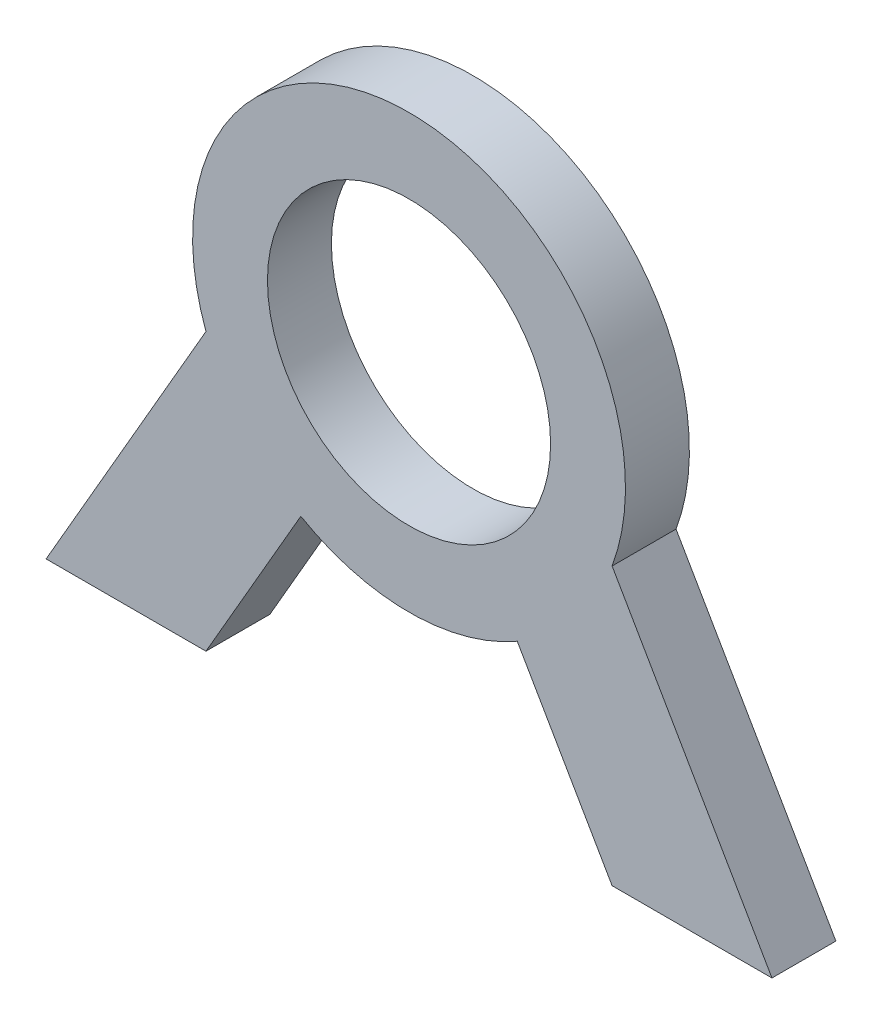
ISO-10303-21;
HEADER;
FILE_DESCRIPTION(('STEP AP214'),'2;1');
FILE_NAME('part.step','',(''),(''),'','','');
FILE_SCHEMA(('AUTOMOTIVE_DESIGN { 1 0 10303 214 1 1 1 1 }'));
ENDSEC;
DATA;
#1=APPLICATION_CONTEXT('core data for automotive mechanical design processes');
#2=APPLICATION_PROTOCOL_DEFINITION('international standard','automotive_design',2000,#1);
#3=PRODUCT_CONTEXT('',#1,'mechanical');
#4=PRODUCT('Part','Part','',(#3));
#5=PRODUCT_RELATED_PRODUCT_CATEGORY('part','',(#4));
#6=PRODUCT_DEFINITION_FORMATION('','',#4);
#7=PRODUCT_DEFINITION_CONTEXT('part definition',#1,'design');
#8=PRODUCT_DEFINITION('design','',#6,#7);
#9=PRODUCT_DEFINITION_SHAPE('','',#8);
#10=(LENGTH_UNIT() NAMED_UNIT(*) SI_UNIT(.MILLI.,.METRE.));
#11=(NAMED_UNIT(*) PLANE_ANGLE_UNIT() SI_UNIT($,.RADIAN.));
#12=(NAMED_UNIT(*) SI_UNIT($,.STERADIAN.) SOLID_ANGLE_UNIT());
#13=UNCERTAINTY_MEASURE_WITH_UNIT(LENGTH_MEASURE(1.E-05),#10,'distance_accuracy_value','');
#14=(GEOMETRIC_REPRESENTATION_CONTEXT(3) GLOBAL_UNCERTAINTY_ASSIGNED_CONTEXT((#13)) GLOBAL_UNIT_ASSIGNED_CONTEXT((#10,
#11,#12)) REPRESENTATION_CONTEXT('',''));
#15=CARTESIAN_POINT('',(0.,0.,0.));
#16=DIRECTION('',(0.,0.,1.));
#17=DIRECTION('',(1.,0.,0.));
#18=AXIS2_PLACEMENT_3D('',#15,#16,#17);
#19=CARTESIAN_POINT('',(0.,27.9451054,5.08));
#20=DIRECTION('',(0.,0.,1.));
#21=DIRECTION('',(1.,0.,0.));
#22=AXIS2_PLACEMENT_3D('',#19,#20,#21);
#23=PLANE('',#22);
#24=DIRECTION('',(1.,0.,0.));
#25=VECTOR('',#24,1.);
#26=CARTESIAN_POINT('',(16.1341141252224,0.,5.08));
#27=LINE('',#26,#25);
#28=CARTESIAN_POINT('',(16.1341141252224,0.,5.08));
#29=VERTEX_POINT('',#28);
#30=CARTESIAN_POINT('',(28.8341141252224,0.,5.08));
#31=VERTEX_POINT('',#30);
#32=EDGE_CURVE('E168',#29,#31,#27,.T.);
#33=ORIENTED_EDGE('',*,*,#32,.T.);
#34=DIRECTION('',(-0.499999999999998,0.86602540378444,0.));
#35=VECTOR('',#34,1.);
#36=CARTESIAN_POINT('',(28.8341141252224,0.,5.08));
#37=LINE('',#36,#35);
#38=CARTESIAN_POINT('',(16.1341141252224,21.9970452561248,5.08));
#39=VERTEX_POINT('',#38);
#40=EDGE_CURVE('E104',#31,#39,#37,.T.);
#41=ORIENTED_EDGE('',*,*,#40,.T.);
#42=CARTESIAN_POINT('',(0.,27.9451054,5.08));
#43=DIRECTION('',(0.,0.,1.));
#44=DIRECTION('',(1.,0.,0.));
#45=AXIS2_PLACEMENT_3D('',#42,#43,#44);
#46=CIRCLE('',#45,17.1956115936845);
#47=CARTESIAN_POINT('',(-16.1341141252225,21.997045256125,5.08));
#48=VERTEX_POINT('',#47);
#49=EDGE_CURVE('E189',#39,#48,#46,.T.);
#50=ORIENTED_EDGE('',*,*,#49,.T.);
#51=DIRECTION('',(-0.5,-0.866025403784438,0.));
#52=VECTOR('',#51,1.);
#53=CARTESIAN_POINT('',(-28.8341141252226,0.,5.08));
#54=LINE('',#53,#52);
#55=CARTESIAN_POINT('',(-28.8341141252226,0.,5.08));
#56=VERTEX_POINT('',#55);
#57=EDGE_CURVE('E203',#48,#56,#54,.T.);
#58=ORIENTED_EDGE('',*,*,#57,.T.);
#59=DIRECTION('',(1.,0.,0.));
#60=VECTOR('',#59,1.);
#61=CARTESIAN_POINT('',(-16.1341141252226,0.,5.08));
#62=LINE('',#61,#60);
#63=CARTESIAN_POINT('',(-16.1341141252226,0.,5.08));
#64=VERTEX_POINT('',#63);
#65=EDGE_CURVE('E123',#56,#64,#62,.T.);
#66=ORIENTED_EDGE('',*,*,#65,.T.);
#67=DIRECTION('',(0.500000000000004,0.866025403784436,0.));
#68=VECTOR('',#67,1.);
#69=CARTESIAN_POINT('',(-16.1341141252226,0.,5.08));
#70=LINE('',#69,#68);
#71=CARTESIAN_POINT('',(-8.59780579684235,13.053268926259,5.08));
#72=VERTEX_POINT('',#71);
#73=EDGE_CURVE('E117',#64,#72,#70,.T.);
#74=ORIENTED_EDGE('',*,*,#73,.T.);
#75=CARTESIAN_POINT('',(0.,27.9451054,5.08));
#76=DIRECTION('',(0.,0.,1.));
#77=DIRECTION('',(1.,0.,0.));
#78=AXIS2_PLACEMENT_3D('',#75,#76,#77);
#79=CIRCLE('',#78,17.1956115936845);
#80=CARTESIAN_POINT('',(8.59780579684223,13.0532689262589,5.08));
#81=VERTEX_POINT('',#80);
#82=EDGE_CURVE('E121',#72,#81,#79,.T.);
#83=ORIENTED_EDGE('',*,*,#82,.T.);
#84=DIRECTION('',(0.499999999999998,-0.86602540378444,0.));
#85=VECTOR('',#84,1.);
#86=CARTESIAN_POINT('',(16.1341141252224,0.,5.08));
#87=LINE('',#86,#85);
#88=EDGE_CURVE('E61',#81,#29,#87,.T.);
#89=ORIENTED_EDGE('',*,*,#88,.T.);
#90=EDGE_LOOP('',(#33,#41,#50,#58,#66,#74,#83,#89));
#91=FACE_BOUND('',#90,.T.);
#92=CARTESIAN_POINT('',(0.,27.9451054,5.08));
#93=DIRECTION('',(0.,0.,1.));
#94=DIRECTION('',(1.,0.,0.));
#95=AXIS2_PLACEMENT_3D('',#92,#93,#94);
#96=CIRCLE('',#95,11.24712);
#97=CARTESIAN_POINT('',(11.24712,27.9451054,5.08));
#98=VERTEX_POINT('',#97);
#99=EDGE_CURVE('E150',#98,#98,#96,.T.);
#100=ORIENTED_EDGE('',*,*,#99,.F.);
#101=EDGE_LOOP('',(#100));
#102=FACE_BOUND('',#101,.T.);
#103=ADVANCED_FACE('F43',(#91,#102),#23,.T.);
#104=CARTESIAN_POINT('',(0.,27.9451054,0.));
#105=DIRECTION('',(0.,0.,1.));
#106=DIRECTION('',(1.,0.,0.));
#107=AXIS2_PLACEMENT_3D('',#104,#105,#106);
#108=PLANE('',#107);
#109=DIRECTION('',(1.,0.,0.));
#110=VECTOR('',#109,1.);
#111=CARTESIAN_POINT('',(16.1341141252224,0.,0.));
#112=LINE('',#111,#110);
#113=CARTESIAN_POINT('',(16.1341141252224,0.,0.));
#114=VERTEX_POINT('',#113);
#115=CARTESIAN_POINT('',(28.8341141252224,0.,0.));
#116=VERTEX_POINT('',#115);
#117=EDGE_CURVE('E145',#114,#116,#112,.T.);
#118=ORIENTED_EDGE('',*,*,#117,.F.);
#119=DIRECTION('',(0.499999999999998,-0.86602540378444,0.));
#120=VECTOR('',#119,1.);
#121=CARTESIAN_POINT('',(16.1341141252224,0.,0.));
#122=LINE('',#121,#120);
#123=CARTESIAN_POINT('',(8.59780579684223,13.0532689262589,0.));
#124=VERTEX_POINT('',#123);
#125=EDGE_CURVE('E96',#124,#114,#122,.T.);
#126=ORIENTED_EDGE('',*,*,#125,.F.);
#127=CARTESIAN_POINT('',(0.,27.9451054,0.));
#128=DIRECTION('',(0.,0.,1.));
#129=DIRECTION('',(1.,0.,0.));
#130=AXIS2_PLACEMENT_3D('',#127,#128,#129);
#131=CIRCLE('',#130,17.1956115936845);
#132=CARTESIAN_POINT('',(-8.59780579684235,13.053268926259,0.));
#133=VERTEX_POINT('',#132);
#134=EDGE_CURVE('E90',#133,#124,#131,.T.);
#135=ORIENTED_EDGE('',*,*,#134,.F.);
#136=DIRECTION('',(0.500000000000004,0.866025403784436,0.));
#137=VECTOR('',#136,1.);
#138=CARTESIAN_POINT('',(-16.1341141252226,0.,0.));
#139=LINE('',#138,#137);
#140=CARTESIAN_POINT('',(-16.1341141252226,0.,0.));
#141=VERTEX_POINT('',#140);
#142=EDGE_CURVE('E132',#141,#133,#139,.T.);
#143=ORIENTED_EDGE('',*,*,#142,.F.);
#144=DIRECTION('',(1.,0.,0.));
#145=VECTOR('',#144,1.);
#146=CARTESIAN_POINT('',(-16.1341141252226,0.,0.));
#147=LINE('',#146,#145);
#148=CARTESIAN_POINT('',(-28.8341141252226,0.,0.));
#149=VERTEX_POINT('',#148);
#150=EDGE_CURVE('E159',#149,#141,#147,.T.);
#151=ORIENTED_EDGE('',*,*,#150,.F.);
#152=DIRECTION('',(-0.5,-0.866025403784438,0.));
#153=VECTOR('',#152,1.);
#154=CARTESIAN_POINT('',(-28.8341141252226,0.,0.));
#155=LINE('',#154,#153);
#156=CARTESIAN_POINT('',(-16.1341141252225,21.997045256125,0.));
#157=VERTEX_POINT('',#156);
#158=EDGE_CURVE('E156',#157,#149,#155,.T.);
#159=ORIENTED_EDGE('',*,*,#158,.F.);
#160=CARTESIAN_POINT('',(0.,27.9451054,0.));
#161=DIRECTION('',(0.,0.,1.));
#162=DIRECTION('',(1.,0.,0.));
#163=AXIS2_PLACEMENT_3D('',#160,#161,#162);
#164=CIRCLE('',#163,17.1956115936845);
#165=CARTESIAN_POINT('',(16.1341141252224,21.9970452561248,0.));
#166=VERTEX_POINT('',#165);
#167=EDGE_CURVE('E153',#166,#157,#164,.T.);
#168=ORIENTED_EDGE('',*,*,#167,.F.);
#169=DIRECTION('',(-0.499999999999998,0.86602540378444,0.));
#170=VECTOR('',#169,1.);
#171=CARTESIAN_POINT('',(28.8341141252224,0.,0.));
#172=LINE('',#171,#170);
#173=EDGE_CURVE('E149',#116,#166,#172,.T.);
#174=ORIENTED_EDGE('',*,*,#173,.F.);
#175=EDGE_LOOP('',(#118,#126,#135,#143,#151,#159,#168,#174));
#176=FACE_BOUND('',#175,.T.);
#177=CARTESIAN_POINT('',(0.,27.9451054,0.));
#178=DIRECTION('',(0.,0.,1.));
#179=DIRECTION('',(1.,0.,0.));
#180=AXIS2_PLACEMENT_3D('',#177,#178,#179);
#181=CIRCLE('',#180,11.24712);
#182=CARTESIAN_POINT('',(11.24712,27.9451054,0.));
#183=VERTEX_POINT('',#182);
#184=EDGE_CURVE('E213',#183,#183,#181,.T.);
#185=ORIENTED_EDGE('',*,*,#184,.T.);
#186=EDGE_LOOP('',(#185));
#187=FACE_BOUND('',#186,.T.);
#188=ADVANCED_FACE('F193',(#176,#187),#108,.F.);
#189=CARTESIAN_POINT('',(16.1341141252224,0.,5.08));
#190=DIRECTION('',(0.,1.,0.));
#191=DIRECTION('',(-1.,0.,0.));
#192=AXIS2_PLACEMENT_3D('',#189,#190,#191);
#193=PLANE('',#192);
#194=ORIENTED_EDGE('',*,*,#117,.T.);
#195=DIRECTION('',(0.,0.,-1.));
#196=VECTOR('',#195,1.);
#197=CARTESIAN_POINT('',(28.8341141252224,0.,5.08));
#198=LINE('',#197,#196);
#199=EDGE_CURVE('E11',#31,#116,#198,.T.);
#200=ORIENTED_EDGE('',*,*,#199,.F.);
#201=ORIENTED_EDGE('',*,*,#32,.F.);
#202=DIRECTION('',(0.,0.,-1.));
#203=VECTOR('',#202,1.);
#204=CARTESIAN_POINT('',(16.1341141252224,0.,5.08));
#205=LINE('',#204,#203);
#206=EDGE_CURVE('E141',#29,#114,#205,.T.);
#207=ORIENTED_EDGE('',*,*,#206,.T.);
#208=EDGE_LOOP('',(#194,#200,#201,#207));
#209=FACE_BOUND('',#208,.T.);
#210=ADVANCED_FACE('F45',(#209),#193,.F.);
#211=CARTESIAN_POINT('',(28.8341141252224,0.,5.08));
#212=DIRECTION('',(-0.86602540378444,-0.499999999999998,0.));
#213=DIRECTION('',(0.499999999999998,-0.86602540378444,0.));
#214=AXIS2_PLACEMENT_3D('',#211,#212,#213);
#215=PLANE('',#214);
#216=ORIENTED_EDGE('',*,*,#173,.T.);
#217=DIRECTION('',(0.,0.,-1.));
#218=VECTOR('',#217,1.);
#219=CARTESIAN_POINT('',(16.1341141252224,21.9970452561248,5.08));
#220=LINE('',#219,#218);
#221=EDGE_CURVE('E53',#39,#166,#220,.T.);
#222=ORIENTED_EDGE('',*,*,#221,.F.);
#223=ORIENTED_EDGE('',*,*,#40,.F.);
#224=ORIENTED_EDGE('',*,*,#199,.T.);
#225=EDGE_LOOP('',(#216,#222,#223,#224));
#226=FACE_BOUND('',#225,.T.);
#227=ADVANCED_FACE('F243',(#226),#215,.F.);
#228=CARTESIAN_POINT('',(0.,27.9451054,5.08));
#229=DIRECTION('',(0.,0.,-1.));
#230=DIRECTION('',(-1.,0.,0.));
#231=AXIS2_PLACEMENT_3D('',#228,#229,#230);
#232=CYLINDRICAL_SURFACE('',#231,17.1956115936845);
#233=ORIENTED_EDGE('',*,*,#167,.T.);
#234=DIRECTION('',(0.,0.,-1.));
#235=VECTOR('',#234,1.);
#236=CARTESIAN_POINT('',(-16.1341141252225,21.997045256125,5.08));
#237=LINE('',#236,#235);
#238=EDGE_CURVE('E179',#48,#157,#237,.T.);
#239=ORIENTED_EDGE('',*,*,#238,.F.);
#240=ORIENTED_EDGE('',*,*,#49,.F.);
#241=ORIENTED_EDGE('',*,*,#221,.T.);
#242=EDGE_LOOP('',(#233,#239,#240,#241));
#243=FACE_BOUND('',#242,.T.);
#244=ADVANCED_FACE('F187',(#243),#232,.T.);
#245=CARTESIAN_POINT('',(-28.8341141252226,0.,5.08));
#246=DIRECTION('',(0.866025403784438,-0.5,0.));
#247=DIRECTION('',(0.500000000000001,0.866025403784438,0.));
#248=AXIS2_PLACEMENT_3D('',#245,#246,#247);
#249=PLANE('',#248);
#250=ORIENTED_EDGE('',*,*,#158,.T.);
#251=DIRECTION('',(0.,0.,-1.));
#252=VECTOR('',#251,1.);
#253=CARTESIAN_POINT('',(-28.8341141252226,0.,5.08));
#254=LINE('',#253,#252);
#255=EDGE_CURVE('E175',#56,#149,#254,.T.);
#256=ORIENTED_EDGE('',*,*,#255,.F.);
#257=ORIENTED_EDGE('',*,*,#57,.F.);
#258=ORIENTED_EDGE('',*,*,#238,.T.);
#259=EDGE_LOOP('',(#250,#256,#257,#258));
#260=FACE_BOUND('',#259,.T.);
#261=ADVANCED_FACE('F198',(#260),#249,.F.);
#262=CARTESIAN_POINT('',(-16.1341141252226,0.,5.08));
#263=DIRECTION('',(0.,1.,0.));
#264=DIRECTION('',(-1.,0.,0.));
#265=AXIS2_PLACEMENT_3D('',#262,#263,#264);
#266=PLANE('',#265);
#267=ORIENTED_EDGE('',*,*,#150,.T.);
#268=DIRECTION('',(0.,0.,-1.));
#269=VECTOR('',#268,1.);
#270=CARTESIAN_POINT('',(-16.1341141252226,0.,5.08));
#271=LINE('',#270,#269);
#272=EDGE_CURVE('E134',#64,#141,#271,.T.);
#273=ORIENTED_EDGE('',*,*,#272,.F.);
#274=ORIENTED_EDGE('',*,*,#65,.F.);
#275=ORIENTED_EDGE('',*,*,#255,.T.);
#276=EDGE_LOOP('',(#267,#273,#274,#275));
#277=FACE_BOUND('',#276,.T.);
#278=ADVANCED_FACE('F201',(#277),#266,.F.);
#279=CARTESIAN_POINT('',(-16.1341141252226,0.,5.08));
#280=DIRECTION('',(-0.866025403784436,0.500000000000004,0.));
#281=DIRECTION('',(-0.500000000000004,-0.866025403784436,0.));
#282=AXIS2_PLACEMENT_3D('',#279,#280,#281);
#283=PLANE('',#282);
#284=ORIENTED_EDGE('',*,*,#142,.T.);
#285=DIRECTION('',(0.,0.,-1.));
#286=VECTOR('',#285,1.);
#287=CARTESIAN_POINT('',(-8.59780579684235,13.053268926259,5.08));
#288=LINE('',#287,#286);
#289=EDGE_CURVE('E129',#72,#133,#288,.T.);
#290=ORIENTED_EDGE('',*,*,#289,.F.);
#291=ORIENTED_EDGE('',*,*,#73,.F.);
#292=ORIENTED_EDGE('',*,*,#272,.T.);
#293=EDGE_LOOP('',(#284,#290,#291,#292));
#294=FACE_BOUND('',#293,.T.);
#295=ADVANCED_FACE('F130',(#294),#283,.F.);
#296=CARTESIAN_POINT('',(0.,27.9451054,5.08));
#297=DIRECTION('',(0.,0.,-1.));
#298=DIRECTION('',(-1.,0.,0.));
#299=AXIS2_PLACEMENT_3D('',#296,#297,#298);
#300=CYLINDRICAL_SURFACE('',#299,17.1956115936845);
#301=ORIENTED_EDGE('',*,*,#134,.T.);
#302=DIRECTION('',(0.,0.,-1.));
#303=VECTOR('',#302,1.);
#304=CARTESIAN_POINT('',(8.59780579684223,13.0532689262589,5.08));
#305=LINE('',#304,#303);
#306=EDGE_CURVE('E135',#81,#124,#305,.T.);
#307=ORIENTED_EDGE('',*,*,#306,.F.);
#308=ORIENTED_EDGE('',*,*,#82,.F.);
#309=ORIENTED_EDGE('',*,*,#289,.T.);
#310=EDGE_LOOP('',(#301,#307,#308,#309));
#311=FACE_BOUND('',#310,.T.);
#312=ADVANCED_FACE('F137',(#311),#300,.T.);
#313=CARTESIAN_POINT('',(16.1341141252224,0.,5.08));
#314=DIRECTION('',(0.86602540378444,0.499999999999998,0.));
#315=DIRECTION('',(-0.499999999999998,0.86602540378444,0.));
#316=AXIS2_PLACEMENT_3D('',#313,#314,#315);
#317=PLANE('',#316);
#318=ORIENTED_EDGE('',*,*,#125,.T.);
#319=ORIENTED_EDGE('',*,*,#206,.F.);
#320=ORIENTED_EDGE('',*,*,#88,.F.);
#321=ORIENTED_EDGE('',*,*,#306,.T.);
#322=EDGE_LOOP('',(#318,#319,#320,#321));
#323=FACE_BOUND('',#322,.T.);
#324=ADVANCED_FACE('F231',(#323),#317,.F.);
#325=CARTESIAN_POINT('',(0.,27.9451054,5.08));
#326=DIRECTION('',(0.,0.,-1.));
#327=DIRECTION('',(-1.,0.,0.));
#328=AXIS2_PLACEMENT_3D('',#325,#326,#327);
#329=CYLINDRICAL_SURFACE('',#328,11.24712);
#330=ORIENTED_EDGE('',*,*,#99,.T.);
#331=EDGE_LOOP('',(#330));
#332=FACE_BOUND('',#331,.T.);
#333=ORIENTED_EDGE('',*,*,#184,.F.);
#334=EDGE_LOOP('',(#333));
#335=FACE_BOUND('',#334,.T.);
#336=ADVANCED_FACE('F221',(#332,#335),#329,.F.);
#337=CLOSED_SHELL('',(#103,#188,#210,#227,#244,#261,#278,#295,#312,#324,#336));
#338=MANIFOLD_SOLID_BREP('B2',#337);
#339=ADVANCED_BREP_SHAPE_REPRESENTATION('',(#18,#338),#14);
#340=SHAPE_DEFINITION_REPRESENTATION(#9,#339);
ENDSEC;
END-ISO-10303-21;
